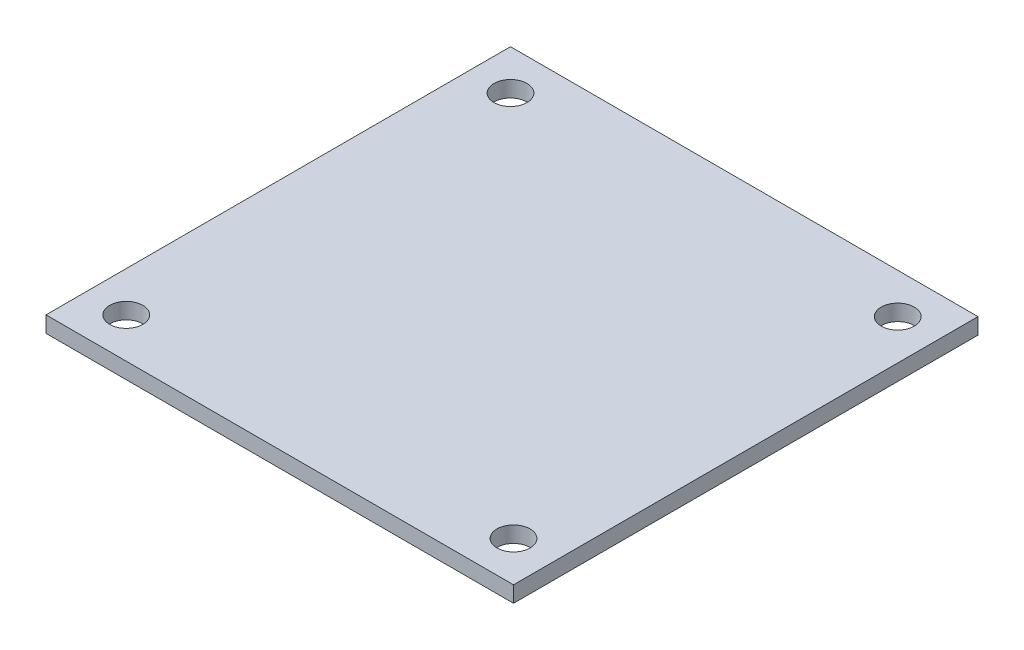
ISO-10303-21;
HEADER;
FILE_DESCRIPTION(('STEP AP214'),'2;1');
FILE_NAME('part.step','',(''),(''),'','','');
FILE_SCHEMA(('AUTOMOTIVE_DESIGN { 1 0 10303 214 1 1 1 1 }'));
ENDSEC;
DATA;
#1=APPLICATION_CONTEXT('core data for automotive mechanical design processes');
#2=APPLICATION_PROTOCOL_DEFINITION('international standard','automotive_design',2000,#1);
#3=PRODUCT_CONTEXT('',#1,'mechanical');
#4=PRODUCT('Part','Part','',(#3));
#5=PRODUCT_RELATED_PRODUCT_CATEGORY('part','',(#4));
#6=PRODUCT_DEFINITION_FORMATION('','',#4);
#7=PRODUCT_DEFINITION_CONTEXT('part definition',#1,'design');
#8=PRODUCT_DEFINITION('design','',#6,#7);
#9=PRODUCT_DEFINITION_SHAPE('','',#8);
#10=(LENGTH_UNIT() NAMED_UNIT(*) SI_UNIT(.MILLI.,.METRE.));
#11=(NAMED_UNIT(*) PLANE_ANGLE_UNIT() SI_UNIT($,.RADIAN.));
#12=(NAMED_UNIT(*) SI_UNIT($,.STERADIAN.) SOLID_ANGLE_UNIT());
#13=UNCERTAINTY_MEASURE_WITH_UNIT(LENGTH_MEASURE(1.E-05),#10,'distance_accuracy_value','');
#14=(GEOMETRIC_REPRESENTATION_CONTEXT(3) GLOBAL_UNCERTAINTY_ASSIGNED_CONTEXT((#13)) GLOBAL_UNIT_ASSIGNED_CONTEXT((#10,
#11,#12)) REPRESENTATION_CONTEXT('',''));
#15=CARTESIAN_POINT('',(0.,0.,0.));
#16=DIRECTION('',(0.,0.,1.));
#17=DIRECTION('',(1.,0.,0.));
#18=AXIS2_PLACEMENT_3D('',#15,#16,#17);
#19=CARTESIAN_POINT('',(-7.98453058300308,1.6,21.8950233284579));
#20=DIRECTION('',(1.,0.,0.));
#21=DIRECTION('',(0.,0.,-1.));
#22=AXIS2_PLACEMENT_3D('',#19,#20,#21);
#23=PLANE('',#22);
#24=DIRECTION('',(0.,0.,1.));
#25=VECTOR('',#24,1.);
#26=CARTESIAN_POINT('',(-7.98453058300308,0.,21.8950233284579));
#27=LINE('',#26,#25);
#28=CARTESIAN_POINT('',(-7.98453058300308,0.,-24.4049766715421));
#29=VERTEX_POINT('',#28);
#30=CARTESIAN_POINT('',(-7.98453058300308,0.,21.8950233284579));
#31=VERTEX_POINT('',#30);
#32=EDGE_CURVE('E100',#29,#31,#27,.T.);
#33=ORIENTED_EDGE('',*,*,#32,.T.);
#34=DIRECTION('',(0.,-1.,0.));
#35=VECTOR('',#34,1.);
#36=CARTESIAN_POINT('',(-7.98453058300308,1.6,21.8950233284579));
#37=LINE('',#36,#35);
#38=CARTESIAN_POINT('',(-7.98453058300308,1.6,21.8950233284579));
#39=VERTEX_POINT('',#38);
#40=EDGE_CURVE('E11',#39,#31,#37,.T.);
#41=ORIENTED_EDGE('',*,*,#40,.F.);
#42=DIRECTION('',(0.,0.,1.));
#43=VECTOR('',#42,1.);
#44=CARTESIAN_POINT('',(-7.98453058300308,1.6,21.8950233284579));
#45=LINE('',#44,#43);
#46=CARTESIAN_POINT('',(-7.98453058300308,1.6,-24.4049766715421));
#47=VERTEX_POINT('',#46);
#48=EDGE_CURVE('E88',#47,#39,#45,.T.);
#49=ORIENTED_EDGE('',*,*,#48,.F.);
#50=DIRECTION('',(0.,-1.,0.));
#51=VECTOR('',#50,1.);
#52=CARTESIAN_POINT('',(-7.98453058300308,1.6,-24.4049766715421));
#53=LINE('',#52,#51);
#54=EDGE_CURVE('E96',#47,#29,#53,.T.);
#55=ORIENTED_EDGE('',*,*,#54,.T.);
#56=EDGE_LOOP('',(#33,#41,#49,#55));
#57=FACE_BOUND('',#56,.T.);
#58=ADVANCED_FACE('F37',(#57),#23,.F.);
#59=CARTESIAN_POINT('',(-7.98453058300308,1.6,21.8950233284579));
#60=DIRECTION('',(0.,0.,-1.));
#61=DIRECTION('',(-1.,0.,0.));
#62=AXIS2_PLACEMENT_3D('',#59,#60,#61);
#63=PLANE('',#62);
#64=DIRECTION('',(1.,0.,0.));
#65=VECTOR('',#64,1.);
#66=CARTESIAN_POINT('',(-7.98453058300308,0.,21.8950233284579));
#67=LINE('',#66,#65);
#68=CARTESIAN_POINT('',(38.6154694169969,0.,21.8950233284579));
#69=VERTEX_POINT('',#68);
#70=EDGE_CURVE('E92',#31,#69,#67,.T.);
#71=ORIENTED_EDGE('',*,*,#70,.T.);
#72=DIRECTION('',(0.,-1.,0.));
#73=VECTOR('',#72,1.);
#74=CARTESIAN_POINT('',(38.6154694169969,1.6,21.8950233284579));
#75=LINE('',#74,#73);
#76=CARTESIAN_POINT('',(38.6154694169969,1.6,21.8950233284579));
#77=VERTEX_POINT('',#76);
#78=EDGE_CURVE('E45',#77,#69,#75,.T.);
#79=ORIENTED_EDGE('',*,*,#78,.F.);
#80=DIRECTION('',(1.,0.,0.));
#81=VECTOR('',#80,1.);
#82=CARTESIAN_POINT('',(-7.98453058300308,1.6,21.8950233284579));
#83=LINE('',#82,#81);
#84=EDGE_CURVE('E83',#39,#77,#83,.T.);
#85=ORIENTED_EDGE('',*,*,#84,.F.);
#86=ORIENTED_EDGE('',*,*,#40,.T.);
#87=EDGE_LOOP('',(#71,#79,#85,#86));
#88=FACE_BOUND('',#87,.T.);
#89=ADVANCED_FACE('F91',(#88),#63,.F.);
#90=CARTESIAN_POINT('',(38.6154694169969,1.6,21.8950233284579));
#91=DIRECTION('',(-1.,0.,0.));
#92=DIRECTION('',(0.,0.,1.));
#93=AXIS2_PLACEMENT_3D('',#90,#91,#92);
#94=PLANE('',#93);
#95=DIRECTION('',(0.,0.,-1.));
#96=VECTOR('',#95,1.);
#97=CARTESIAN_POINT('',(38.6154694169969,0.,21.8950233284579));
#98=LINE('',#97,#96);
#99=CARTESIAN_POINT('',(38.6154694169969,0.,-24.4049766715421));
#100=VERTEX_POINT('',#99);
#101=EDGE_CURVE('E70',#69,#100,#98,.T.);
#102=ORIENTED_EDGE('',*,*,#101,.T.);
#103=DIRECTION('',(0.,-1.,0.));
#104=VECTOR('',#103,1.);
#105=CARTESIAN_POINT('',(38.6154694169969,1.6,-24.4049766715421));
#106=LINE('',#105,#104);
#107=CARTESIAN_POINT('',(38.6154694169969,1.6,-24.4049766715421));
#108=VERTEX_POINT('',#107);
#109=EDGE_CURVE('E93',#108,#100,#106,.T.);
#110=ORIENTED_EDGE('',*,*,#109,.F.);
#111=DIRECTION('',(0.,0.,-1.));
#112=VECTOR('',#111,1.);
#113=CARTESIAN_POINT('',(38.6154694169969,1.6,21.8950233284579));
#114=LINE('',#113,#112);
#115=EDGE_CURVE('E86',#77,#108,#114,.T.);
#116=ORIENTED_EDGE('',*,*,#115,.F.);
#117=ORIENTED_EDGE('',*,*,#78,.T.);
#118=EDGE_LOOP('',(#102,#110,#116,#117));
#119=FACE_BOUND('',#118,.T.);
#120=ADVANCED_FACE('F94',(#119),#94,.F.);
#121=CARTESIAN_POINT('',(-7.98453058300308,1.6,-24.4049766715421));
#122=DIRECTION('',(0.,0.,1.));
#123=DIRECTION('',(1.,0.,0.));
#124=AXIS2_PLACEMENT_3D('',#121,#122,#123);
#125=PLANE('',#124);
#126=DIRECTION('',(-1.,0.,0.));
#127=VECTOR('',#126,1.);
#128=CARTESIAN_POINT('',(-7.98453058300308,0.,-24.4049766715421));
#129=LINE('',#128,#127);
#130=EDGE_CURVE('E76',#100,#29,#129,.T.);
#131=ORIENTED_EDGE('',*,*,#130,.T.);
#132=ORIENTED_EDGE('',*,*,#54,.F.);
#133=DIRECTION('',(-1.,0.,0.));
#134=VECTOR('',#133,1.);
#135=CARTESIAN_POINT('',(-7.98453058300308,1.6,-24.4049766715421));
#136=LINE('',#135,#134);
#137=EDGE_CURVE('E53',#108,#47,#136,.T.);
#138=ORIENTED_EDGE('',*,*,#137,.F.);
#139=ORIENTED_EDGE('',*,*,#109,.T.);
#140=EDGE_LOOP('',(#131,#132,#138,#139));
#141=FACE_BOUND('',#140,.T.);
#142=ADVANCED_FACE('F108',(#141),#125,.F.);
#143=CARTESIAN_POINT('',(0.,1.6,0.));
#144=DIRECTION('',(0.,-1.,0.));
#145=DIRECTION('',(0.,0.,-1.));
#146=AXIS2_PLACEMENT_3D('',#143,#144,#145);
#147=PLANE('',#146);
#148=CARTESIAN_POINT('',(34.6154694169969,1.6,17.8950233284579));
#149=DIRECTION('',(0.,-1.,0.));
#150=DIRECTION('',(0.,0.,1.));
#151=AXIS2_PLACEMENT_3D('',#148,#149,#150);
#152=CIRCLE('',#151,1.65);
#153=CARTESIAN_POINT('',(34.6154694169969,1.6,19.5450233284579));
#154=VERTEX_POINT('',#153);
#155=EDGE_CURVE('E129',#154,#154,#152,.T.);
#156=ORIENTED_EDGE('',*,*,#155,.T.);
#157=EDGE_LOOP('',(#156));
#158=FACE_BOUND('',#157,.T.);
#159=CARTESIAN_POINT('',(-3.98453058300308,1.6,17.8950233284579));
#160=DIRECTION('',(0.,1.,0.));
#161=DIRECTION('',(0.,0.,1.));
#162=AXIS2_PLACEMENT_3D('',#159,#160,#161);
#163=CIRCLE('',#162,1.65);
#164=CARTESIAN_POINT('',(-3.98453058300308,1.6,19.5450233284579));
#165=VERTEX_POINT('',#164);
#166=EDGE_CURVE('E123',#165,#165,#163,.T.);
#167=ORIENTED_EDGE('',*,*,#166,.F.);
#168=EDGE_LOOP('',(#167));
#169=FACE_BOUND('',#168,.T.);
#170=CARTESIAN_POINT('',(34.6154694169969,1.6,-20.4049766715421));
#171=DIRECTION('',(0.,1.,0.));
#172=DIRECTION('',(0.,0.,-1.));
#173=AXIS2_PLACEMENT_3D('',#170,#171,#172);
#174=CIRCLE('',#173,1.65);
#175=CARTESIAN_POINT('',(34.6154694169969,1.6,-22.0549766715421));
#176=VERTEX_POINT('',#175);
#177=EDGE_CURVE('E117',#176,#176,#174,.T.);
#178=ORIENTED_EDGE('',*,*,#177,.F.);
#179=EDGE_LOOP('',(#178));
#180=FACE_BOUND('',#179,.T.);
#181=CARTESIAN_POINT('',(-3.98453058300308,1.6,-20.4049766715421));
#182=DIRECTION('',(0.,-1.,0.));
#183=DIRECTION('',(0.,0.,-1.));
#184=AXIS2_PLACEMENT_3D('',#181,#182,#183);
#185=CIRCLE('',#184,1.65);
#186=CARTESIAN_POINT('',(-3.98453058300308,1.6,-22.0549766715421));
#187=VERTEX_POINT('',#186);
#188=EDGE_CURVE('E103',#187,#187,#185,.T.);
#189=ORIENTED_EDGE('',*,*,#188,.T.);
#190=EDGE_LOOP('',(#189));
#191=FACE_BOUND('',#190,.T.);
#192=ORIENTED_EDGE('',*,*,#48,.T.);
#193=ORIENTED_EDGE('',*,*,#84,.T.);
#194=ORIENTED_EDGE('',*,*,#115,.T.);
#195=ORIENTED_EDGE('',*,*,#137,.T.);
#196=EDGE_LOOP('',(#192,#193,#194,#195));
#197=FACE_BOUND('',#196,.T.);
#198=ADVANCED_FACE('F84',(#158,#169,#180,#191,#197),#147,.F.);
#199=CARTESIAN_POINT('',(0.,0.,0.));
#200=DIRECTION('',(0.,-1.,0.));
#201=DIRECTION('',(0.,0.,-1.));
#202=AXIS2_PLACEMENT_3D('',#199,#200,#201);
#203=PLANE('',#202);
#204=CARTESIAN_POINT('',(34.6154694169969,0.,17.8950233284579));
#205=DIRECTION('',(0.,-1.,0.));
#206=DIRECTION('',(0.,0.,1.));
#207=AXIS2_PLACEMENT_3D('',#204,#205,#206);
#208=CIRCLE('',#207,1.65);
#209=CARTESIAN_POINT('',(34.6154694169969,0.,19.5450233284579));
#210=VERTEX_POINT('',#209);
#211=EDGE_CURVE('E132',#210,#210,#208,.T.);
#212=ORIENTED_EDGE('',*,*,#211,.F.);
#213=EDGE_LOOP('',(#212));
#214=FACE_BOUND('',#213,.T.);
#215=CARTESIAN_POINT('',(-3.98453058300308,0.,17.8950233284579));
#216=DIRECTION('',(0.,1.,0.));
#217=DIRECTION('',(0.,0.,1.));
#218=AXIS2_PLACEMENT_3D('',#215,#216,#217);
#219=CIRCLE('',#218,1.65);
#220=CARTESIAN_POINT('',(-3.98453058300308,0.,19.5450233284579));
#221=VERTEX_POINT('',#220);
#222=EDGE_CURVE('E126',#221,#221,#219,.T.);
#223=ORIENTED_EDGE('',*,*,#222,.T.);
#224=EDGE_LOOP('',(#223));
#225=FACE_BOUND('',#224,.T.);
#226=CARTESIAN_POINT('',(34.6154694169969,0.,-20.4049766715421));
#227=DIRECTION('',(0.,1.,0.));
#228=DIRECTION('',(0.,0.,-1.));
#229=AXIS2_PLACEMENT_3D('',#226,#227,#228);
#230=CIRCLE('',#229,1.65);
#231=CARTESIAN_POINT('',(34.6154694169969,0.,-22.0549766715421));
#232=VERTEX_POINT('',#231);
#233=EDGE_CURVE('E120',#232,#232,#230,.T.);
#234=ORIENTED_EDGE('',*,*,#233,.T.);
#235=EDGE_LOOP('',(#234));
#236=FACE_BOUND('',#235,.T.);
#237=CARTESIAN_POINT('',(-3.98453058300308,0.,-20.4049766715421));
#238=DIRECTION('',(0.,-1.,0.));
#239=DIRECTION('',(0.,0.,-1.));
#240=AXIS2_PLACEMENT_3D('',#237,#238,#239);
#241=CIRCLE('',#240,1.65);
#242=CARTESIAN_POINT('',(-3.98453058300308,0.,-22.0549766715421));
#243=VERTEX_POINT('',#242);
#244=EDGE_CURVE('E114',#243,#243,#241,.T.);
#245=ORIENTED_EDGE('',*,*,#244,.F.);
#246=EDGE_LOOP('',(#245));
#247=FACE_BOUND('',#246,.T.);
#248=ORIENTED_EDGE('',*,*,#32,.F.);
#249=ORIENTED_EDGE('',*,*,#130,.F.);
#250=ORIENTED_EDGE('',*,*,#101,.F.);
#251=ORIENTED_EDGE('',*,*,#70,.F.);
#252=EDGE_LOOP('',(#248,#249,#250,#251));
#253=FACE_BOUND('',#252,.T.);
#254=ADVANCED_FACE('F111',(#214,#225,#236,#247,#253),#203,.T.);
#255=CARTESIAN_POINT('',(-3.98453058300308,1.6,-20.4049766715421));
#256=DIRECTION('',(0.,-1.,0.));
#257=DIRECTION('',(0.,0.,-1.));
#258=AXIS2_PLACEMENT_3D('',#255,#256,#257);
#259=CYLINDRICAL_SURFACE('',#258,1.65);
#260=ORIENTED_EDGE('',*,*,#188,.F.);
#261=EDGE_LOOP('',(#260));
#262=FACE_BOUND('',#261,.T.);
#263=ORIENTED_EDGE('',*,*,#244,.T.);
#264=EDGE_LOOP('',(#263));
#265=FACE_BOUND('',#264,.T.);
#266=ADVANCED_FACE('F149',(#262,#265),#259,.F.);
#267=CARTESIAN_POINT('',(34.6154694169969,1.6,-20.4049766715421));
#268=DIRECTION('',(0.,-1.,0.));
#269=DIRECTION('',(0.,0.,-1.));
#270=AXIS2_PLACEMENT_3D('',#267,#268,#269);
#271=CYLINDRICAL_SURFACE('',#270,1.65);
#272=ORIENTED_EDGE('',*,*,#177,.T.);
#273=EDGE_LOOP('',(#272));
#274=FACE_BOUND('',#273,.T.);
#275=ORIENTED_EDGE('',*,*,#233,.F.);
#276=EDGE_LOOP('',(#275));
#277=FACE_BOUND('',#276,.T.);
#278=ADVANCED_FACE('F158',(#274,#277),#271,.F.);
#279=CARTESIAN_POINT('',(-3.98453058300308,1.6,17.8950233284579));
#280=DIRECTION('',(0.,-1.,0.));
#281=DIRECTION('',(0.,0.,-1.));
#282=AXIS2_PLACEMENT_3D('',#279,#280,#281);
#283=CYLINDRICAL_SURFACE('',#282,1.65);
#284=ORIENTED_EDGE('',*,*,#166,.T.);
#285=EDGE_LOOP('',(#284));
#286=FACE_BOUND('',#285,.T.);
#287=ORIENTED_EDGE('',*,*,#222,.F.);
#288=EDGE_LOOP('',(#287));
#289=FACE_BOUND('',#288,.T.);
#290=ADVANCED_FACE('F143',(#286,#289),#283,.F.);
#291=CARTESIAN_POINT('',(34.6154694169969,1.6,17.8950233284579));
#292=DIRECTION('',(0.,-1.,0.));
#293=DIRECTION('',(0.,0.,-1.));
#294=AXIS2_PLACEMENT_3D('',#291,#292,#293);
#295=CYLINDRICAL_SURFACE('',#294,1.65);
#296=ORIENTED_EDGE('',*,*,#155,.F.);
#297=EDGE_LOOP('',(#296));
#298=FACE_BOUND('',#297,.T.);
#299=ORIENTED_EDGE('',*,*,#211,.T.);
#300=EDGE_LOOP('',(#299));
#301=FACE_BOUND('',#300,.T.);
#302=ADVANCED_FACE('F140',(#298,#301),#295,.F.);
#303=CLOSED_SHELL('',(#58,#89,#120,#142,#198,#254,#266,#278,#290,#302));
#304=MANIFOLD_SOLID_BREP('B2',#303);
#305=ADVANCED_BREP_SHAPE_REPRESENTATION('',(#18,#304),#14);
#306=SHAPE_DEFINITION_REPRESENTATION(#9,#305);
ENDSEC;
END-ISO-10303-21;
